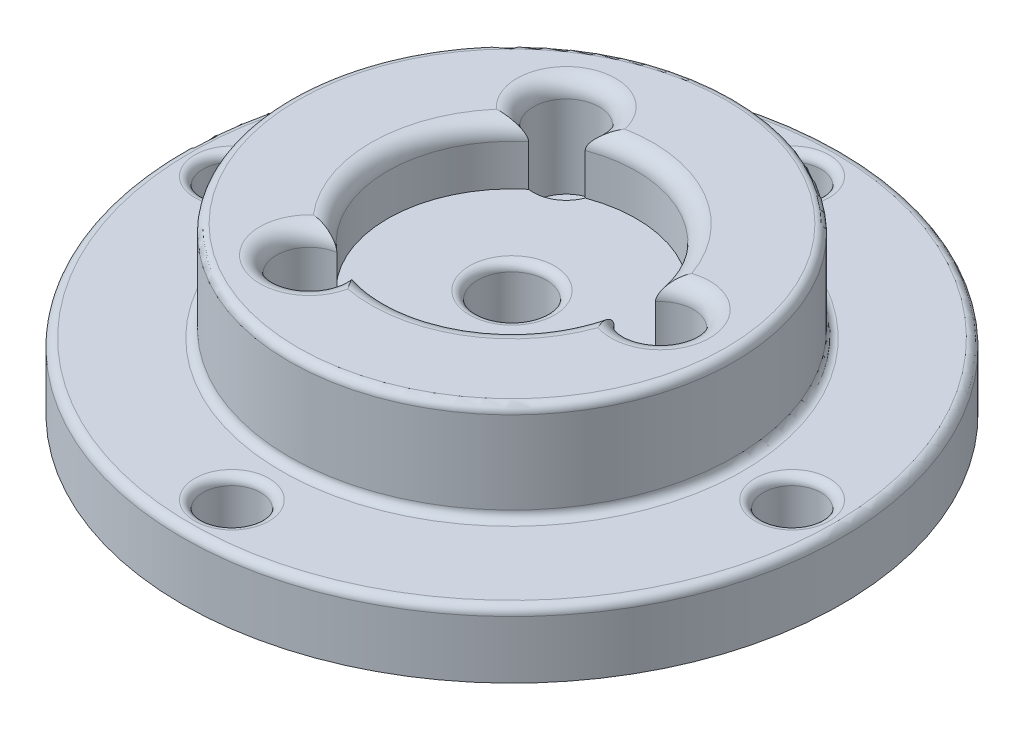
ISO-10303-21;
HEADER;
FILE_DESCRIPTION(('STEP AP214'),'2;1');
FILE_NAME('part.step','',(''),(''),'','','');
FILE_SCHEMA(('AUTOMOTIVE_DESIGN { 1 0 10303 214 1 1 1 1 }'));
ENDSEC;
DATA;
#1=APPLICATION_CONTEXT('core data for automotive mechanical design processes');
#2=APPLICATION_PROTOCOL_DEFINITION('international standard','automotive_design',2000,#1);
#3=PRODUCT_CONTEXT('',#1,'mechanical');
#4=PRODUCT('Part','Part','',(#3));
#5=PRODUCT_RELATED_PRODUCT_CATEGORY('part','',(#4));
#6=PRODUCT_DEFINITION_FORMATION('','',#4);
#7=PRODUCT_DEFINITION_CONTEXT('part definition',#1,'design');
#8=PRODUCT_DEFINITION('design','',#6,#7);
#9=PRODUCT_DEFINITION_SHAPE('','',#8);
#10=(LENGTH_UNIT() NAMED_UNIT(*) SI_UNIT(.MILLI.,.METRE.));
#11=(NAMED_UNIT(*) PLANE_ANGLE_UNIT() SI_UNIT($,.RADIAN.));
#12=(NAMED_UNIT(*) SI_UNIT($,.STERADIAN.) SOLID_ANGLE_UNIT());
#13=UNCERTAINTY_MEASURE_WITH_UNIT(LENGTH_MEASURE(1.E-05),#10,'distance_accuracy_value','');
#14=(GEOMETRIC_REPRESENTATION_CONTEXT(3) GLOBAL_UNCERTAINTY_ASSIGNED_CONTEXT((#13)) GLOBAL_UNIT_ASSIGNED_CONTEXT((#10,
#11,#12)) REPRESENTATION_CONTEXT('',''));
#15=CARTESIAN_POINT('',(0.,0.,0.));
#16=DIRECTION('',(0.,0.,1.));
#17=DIRECTION('',(1.,0.,0.));
#18=AXIS2_PLACEMENT_3D('',#15,#16,#17);
#19=CARTESIAN_POINT('',(0.,2.5,0.));
#20=DIRECTION('',(0.,1.,0.));
#21=DIRECTION('',(0.,0.,1.));
#22=AXIS2_PLACEMENT_3D('',#19,#20,#21);
#23=CYLINDRICAL_SURFACE('',#22,7.55);
#24=DIRECTION('',(0.,1.,0.));
#25=VECTOR('',#24,1.);
#26=CARTESIAN_POINT('',(7.44458333333333,3.,-1.25725056892234));
#27=LINE('',#26,#25);
#28=CARTESIAN_POINT('',(7.44458333333333,2.5,-1.25725056892234));
#29=VERTEX_POINT('',#28);
#30=CARTESIAN_POINT('',(7.44458333333333,5.,-1.25725056892234));
#31=VERTEX_POINT('',#30);
#32=EDGE_CURVE('E131',#29,#31,#27,.T.);
#33=ORIENTED_EDGE('',*,*,#32,.T.);
#34=CARTESIAN_POINT('',(0.,5.,0.));
#35=DIRECTION('',(0.,1.,0.));
#36=DIRECTION('',(0.,0.,1.));
#37=AXIS2_PLACEMENT_3D('',#34,#35,#36);
#38=CIRCLE('',#37,7.55);
#39=CARTESIAN_POINT('',(-2.63348073505741,5.,-7.0758235717181));
#40=VERTEX_POINT('',#39);
#41=EDGE_CURVE('E59',#31,#40,#38,.T.);
#42=ORIENTED_EDGE('',*,*,#41,.T.);
#43=DIRECTION('',(0.,1.,0.));
#44=VECTOR('',#43,1.);
#45=CARTESIAN_POINT('',(-2.63348073505741,3.,-7.0758235717181));
#46=LINE('',#45,#44);
#47=CARTESIAN_POINT('',(-2.63348073505741,2.5,-7.0758235717181));
#48=VERTEX_POINT('',#47);
#49=EDGE_CURVE('E106',#40,#48,#46,.F.);
#50=ORIENTED_EDGE('',*,*,#49,.T.);
#51=CARTESIAN_POINT('',(0.,2.5,0.));
#52=DIRECTION('',(0.,1.,0.));
#53=DIRECTION('',(0.,0.,1.));
#54=AXIS2_PLACEMENT_3D('',#51,#52,#53);
#55=CIRCLE('',#54,7.55);
#56=EDGE_CURVE('E109',#29,#48,#55,.T.);
#57=ORIENTED_EDGE('',*,*,#56,.F.);
#58=EDGE_LOOP('',(#33,#42,#50,#57));
#59=FACE_BOUND('',#58,.T.);
#60=ADVANCED_FACE('F36',(#59),#23,.F.);
#61=DIRECTION('',(0.,1.,0.));
#62=VECTOR('',#61,1.);
#63=CARTESIAN_POINT('',(-2.63348073505751,3.,7.07582357171806));
#64=LINE('',#63,#62);
#65=CARTESIAN_POINT('',(-2.63348073505752,2.5,7.07582357171806));
#66=VERTEX_POINT('',#65);
#67=CARTESIAN_POINT('',(-2.63348073505751,5.,7.07582357171806));
#68=VERTEX_POINT('',#67);
#69=EDGE_CURVE('E135',#66,#68,#64,.T.);
#70=ORIENTED_EDGE('',*,*,#69,.T.);
#71=CARTESIAN_POINT('',(0.,5.,0.));
#72=DIRECTION('',(0.,1.,0.));
#73=DIRECTION('',(0.,0.,1.));
#74=AXIS2_PLACEMENT_3D('',#71,#72,#73);
#75=CIRCLE('',#74,7.55);
#76=CARTESIAN_POINT('',(7.44458333333333,5.,1.25725056892234));
#77=VERTEX_POINT('',#76);
#78=EDGE_CURVE('E387',#68,#77,#75,.T.);
#79=ORIENTED_EDGE('',*,*,#78,.T.);
#80=DIRECTION('',(0.,1.,0.));
#81=VECTOR('',#80,1.);
#82=CARTESIAN_POINT('',(7.44458333333333,3.,1.25725056892234));
#83=LINE('',#82,#81);
#84=CARTESIAN_POINT('',(7.44458333333333,2.5,1.25725056892234));
#85=VERTEX_POINT('',#84);
#86=EDGE_CURVE('E134',#77,#85,#83,.F.);
#87=ORIENTED_EDGE('',*,*,#86,.T.);
#88=EDGE_CURVE('E129',#66,#85,#55,.T.);
#89=ORIENTED_EDGE('',*,*,#88,.F.);
#90=EDGE_LOOP('',(#70,#79,#87,#89));
#91=FACE_BOUND('',#90,.T.);
#92=ADVANCED_FACE('F193',(#91),#23,.F.);
#93=CARTESIAN_POINT('',(0.,6.,0.));
#94=DIRECTION('',(0.,-1.,0.));
#95=DIRECTION('',(0.,0.,-1.));
#96=AXIS2_PLACEMENT_3D('',#93,#94,#95);
#97=CYLINDRICAL_SURFACE('',#96,13.5);
#98=CARTESIAN_POINT('',(0.,5.5,0.));
#99=DIRECTION('',(0.,1.,0.));
#100=DIRECTION('',(0.,0.,1.));
#101=AXIS2_PLACEMENT_3D('',#98,#99,#100);
#102=CIRCLE('',#101,13.5);
#103=CARTESIAN_POINT('',(0.,5.5,13.5));
#104=VERTEX_POINT('',#103);
#105=EDGE_CURVE('E297',#104,#104,#102,.F.);
#106=ORIENTED_EDGE('',*,*,#105,.T.);
#107=EDGE_LOOP('',(#106));
#108=FACE_BOUND('',#107,.T.);
#109=CARTESIAN_POINT('',(0.,0.5,0.));
#110=DIRECTION('',(0.,-1.,0.));
#111=DIRECTION('',(0.,0.,-1.));
#112=AXIS2_PLACEMENT_3D('',#109,#110,#111);
#113=CIRCLE('',#112,13.5);
#114=CARTESIAN_POINT('',(0.,0.5,-13.5));
#115=VERTEX_POINT('',#114);
#116=EDGE_CURVE('E235',#115,#115,#113,.F.);
#117=ORIENTED_EDGE('',*,*,#116,.T.);
#118=EDGE_LOOP('',(#117));
#119=FACE_BOUND('',#118,.T.);
#120=ADVANCED_FACE('F199',(#108,#119),#97,.T.);
#121=CARTESIAN_POINT('',(0.,6.,0.));
#122=DIRECTION('',(0.,1.,0.));
#123=DIRECTION('',(0.,0.,1.));
#124=AXIS2_PLACEMENT_3D('',#121,#122,#123);
#125=PLANE('',#124);
#126=CARTESIAN_POINT('',(0.,6.,0.));
#127=DIRECTION('',(0.,1.,0.));
#128=DIRECTION('',(0.,0.,1.));
#129=AXIS2_PLACEMENT_3D('',#126,#127,#128);
#130=CIRCLE('',#129,13.);
#131=CARTESIAN_POINT('',(0.,6.,13.));
#132=VERTEX_POINT('',#131);
#133=EDGE_CURVE('E232',#132,#132,#130,.T.);
#134=ORIENTED_EDGE('',*,*,#133,.T.);
#135=EDGE_LOOP('',(#134));
#136=FACE_BOUND('',#135,.T.);
#137=CARTESIAN_POINT('',(0.,6.,0.));
#138=DIRECTION('',(0.,1.,0.));
#139=DIRECTION('',(0.,0.,1.));
#140=AXIS2_PLACEMENT_3D('',#137,#138,#139);
#141=CIRCLE('',#140,8.55);
#142=CARTESIAN_POINT('',(8.06125,6.,2.84934175512521));
#143=VERTEX_POINT('',#142);
#144=CARTESIAN_POINT('',(-1.56302265599787,6.,8.4059181638199));
#145=VERTEX_POINT('',#144);
#146=EDGE_CURVE('E376',#143,#145,#141,.F.);
#147=ORIENTED_EDGE('',*,*,#146,.T.);
#148=CARTESIAN_POINT('',(-4.50000000000004,6.,7.79422863405993));
#149=DIRECTION('',(0.,1.,0.));
#150=DIRECTION('',(0.,0.,1.));
#151=AXIS2_PLACEMENT_3D('',#148,#149,#150);
#152=CIRCLE('',#151,3.);
#153=CARTESIAN_POINT('',(-6.49822734400219,6.,5.55657640869467));
#154=VERTEX_POINT('',#153);
#155=EDGE_CURVE('E378',#145,#154,#152,.F.);
#156=ORIENTED_EDGE('',*,*,#155,.T.);
#157=CARTESIAN_POINT('',(0.,6.,0.));
#158=DIRECTION('',(0.,1.,0.));
#159=DIRECTION('',(0.,0.,1.));
#160=AXIS2_PLACEMENT_3D('',#157,#158,#159);
#161=CIRCLE('',#160,8.55);
#162=CARTESIAN_POINT('',(-6.49822734400212,6.,-5.55657640869476));
#163=VERTEX_POINT('',#162);
#164=EDGE_CURVE('E397',#154,#163,#161,.F.);
#165=ORIENTED_EDGE('',*,*,#164,.T.);
#166=CARTESIAN_POINT('',(-4.49999999999993,6.,-7.79422863405999));
#167=DIRECTION('',(0.,1.,0.));
#168=DIRECTION('',(0.,0.,1.));
#169=AXIS2_PLACEMENT_3D('',#166,#167,#168);
#170=CIRCLE('',#169,3.);
#171=CARTESIAN_POINT('',(-1.56302265599775,6.,-8.40591816381992));
#172=VERTEX_POINT('',#171);
#173=EDGE_CURVE('E222',#163,#172,#170,.F.);
#174=ORIENTED_EDGE('',*,*,#173,.T.);
#175=CARTESIAN_POINT('',(0.,6.,0.));
#176=DIRECTION('',(0.,1.,0.));
#177=DIRECTION('',(0.,0.,1.));
#178=AXIS2_PLACEMENT_3D('',#175,#176,#177);
#179=CIRCLE('',#178,8.55);
#180=CARTESIAN_POINT('',(8.06125,6.,-2.84934175512521));
#181=VERTEX_POINT('',#180);
#182=EDGE_CURVE('E407',#172,#181,#179,.F.);
#183=ORIENTED_EDGE('',*,*,#182,.T.);
#184=CARTESIAN_POINT('',(9.,6.,0.));
#185=DIRECTION('',(0.,1.,0.));
#186=DIRECTION('',(0.,0.,1.));
#187=AXIS2_PLACEMENT_3D('',#184,#185,#186);
#188=CIRCLE('',#187,3.);
#189=EDGE_CURVE('E380',#181,#143,#188,.F.);
#190=ORIENTED_EDGE('',*,*,#189,.T.);
#191=EDGE_LOOP('',(#147,#156,#165,#174,#183,#190));
#192=FACE_BOUND('',#191,.T.);
#193=ADVANCED_FACE('F204',(#136,#192),#125,.T.);
#194=DIRECTION('',(0.,1.,0.));
#195=VECTOR('',#194,1.);
#196=CARTESIAN_POINT('',(-4.8111025982758,3.,-5.81857300279578));
#197=LINE('',#196,#195);
#198=CARTESIAN_POINT('',(-4.8111025982758,2.5,-5.81857300279577));
#199=VERTEX_POINT('',#198);
#200=CARTESIAN_POINT('',(-4.8111025982758,5.,-5.81857300279578));
#201=VERTEX_POINT('',#200);
#202=EDGE_CURVE('E111',#199,#201,#197,.T.);
#203=ORIENTED_EDGE('',*,*,#202,.T.);
#204=CARTESIAN_POINT('',(0.,5.,0.));
#205=DIRECTION('',(0.,1.,0.));
#206=DIRECTION('',(0.,0.,1.));
#207=AXIS2_PLACEMENT_3D('',#204,#205,#206);
#208=CIRCLE('',#207,7.55);
#209=CARTESIAN_POINT('',(-4.81110259827588,5.,5.81857300279571));
#210=VERTEX_POINT('',#209);
#211=EDGE_CURVE('E214',#201,#210,#208,.T.);
#212=ORIENTED_EDGE('',*,*,#211,.T.);
#213=DIRECTION('',(0.,1.,0.));
#214=VECTOR('',#213,1.);
#215=CARTESIAN_POINT('',(-4.81110259827588,3.,5.81857300279571));
#216=LINE('',#215,#214);
#217=CARTESIAN_POINT('',(-4.81110259827588,2.5,5.81857300279571));
#218=VERTEX_POINT('',#217);
#219=EDGE_CURVE('E140',#210,#218,#216,.F.);
#220=ORIENTED_EDGE('',*,*,#219,.T.);
#221=EDGE_CURVE('E127',#199,#218,#55,.T.);
#222=ORIENTED_EDGE('',*,*,#221,.F.);
#223=EDGE_LOOP('',(#203,#212,#220,#222));
#224=FACE_BOUND('',#223,.T.);
#225=ADVANCED_FACE('F195',(#224),#23,.F.);
#226=CARTESIAN_POINT('',(0.,2.5,0.));
#227=DIRECTION('',(0.,1.,0.));
#228=DIRECTION('',(0.,0.,1.));
#229=AXIS2_PLACEMENT_3D('',#226,#227,#228);
#230=PLANE('',#229);
#231=CARTESIAN_POINT('',(0.,2.5,0.));
#232=DIRECTION('',(0.,1.,0.));
#233=DIRECTION('',(0.,0.,1.));
#234=AXIS2_PLACEMENT_3D('',#231,#232,#233);
#235=CIRCLE('',#234,2.58280416560833);
#236=CARTESIAN_POINT('',(0.,2.5,2.58280416560833));
#237=VERTEX_POINT('',#236);
#238=EDGE_CURVE('E312',#237,#237,#235,.F.);
#239=ORIENTED_EDGE('',*,*,#238,.T.);
#240=EDGE_LOOP('',(#239));
#241=FACE_BOUND('',#240,.T.);
#242=CARTESIAN_POINT('',(9.,2.5,0.));
#243=DIRECTION('',(0.,1.,0.));
#244=DIRECTION('',(0.,0.,1.));
#245=AXIS2_PLACEMENT_3D('',#242,#243,#244);
#246=CIRCLE('',#245,2.);
#247=EDGE_CURVE('E126',#29,#85,#246,.T.);
#248=ORIENTED_EDGE('',*,*,#247,.F.);
#249=ORIENTED_EDGE('',*,*,#56,.T.);
#250=CARTESIAN_POINT('',(-4.49999999999993,2.5,-7.79422863405999));
#251=DIRECTION('',(0.,1.,0.));
#252=DIRECTION('',(0.,0.,1.));
#253=AXIS2_PLACEMENT_3D('',#250,#251,#252);
#254=CIRCLE('',#253,2.);
#255=EDGE_CURVE('E115',#199,#48,#254,.T.);
#256=ORIENTED_EDGE('',*,*,#255,.F.);
#257=ORIENTED_EDGE('',*,*,#221,.T.);
#258=CARTESIAN_POINT('',(-4.50000000000004,2.5,7.79422863405993));
#259=DIRECTION('',(0.,1.,0.));
#260=DIRECTION('',(0.,0.,1.));
#261=AXIS2_PLACEMENT_3D('',#258,#259,#260);
#262=CIRCLE('',#261,2.);
#263=EDGE_CURVE('E120',#66,#218,#262,.T.);
#264=ORIENTED_EDGE('',*,*,#263,.F.);
#265=ORIENTED_EDGE('',*,*,#88,.T.);
#266=EDGE_LOOP('',(#248,#249,#256,#257,#264,#265));
#267=FACE_BOUND('',#266,.T.);
#268=ADVANCED_FACE('F123',(#241,#267),#230,.T.);
#269=CARTESIAN_POINT('',(-4.49999999999993,-5.65685424949238,-7.79422863405999));
#270=DIRECTION('',(0.,1.,0.));
#271=DIRECTION('',(0.,0.,1.));
#272=AXIS2_PLACEMENT_3D('',#269,#270,#271);
#273=CYLINDRICAL_SURFACE('',#272,2.);
#274=CARTESIAN_POINT('',(-4.49999999999993,0.,-7.79422863405999));
#275=DIRECTION('',(0.,1.,0.));
#276=DIRECTION('',(0.,0.,1.));
#277=AXIS2_PLACEMENT_3D('',#274,#275,#276);
#278=CIRCLE('',#277,2.);
#279=CARTESIAN_POINT('',(-4.49999999999993,0.,-5.79422863405999));
#280=VERTEX_POINT('',#279);
#281=EDGE_CURVE('E143',#280,#280,#278,.F.);
#282=ORIENTED_EDGE('',*,*,#281,.T.);
#283=EDGE_LOOP('',(#282));
#284=FACE_BOUND('',#283,.T.);
#285=ORIENTED_EDGE('',*,*,#49,.F.);
#286=CARTESIAN_POINT('',(-4.49999999999993,5.,-7.79422863405999));
#287=DIRECTION('',(0.,1.,0.));
#288=DIRECTION('',(0.,0.,1.));
#289=AXIS2_PLACEMENT_3D('',#286,#287,#288);
#290=CIRCLE('',#289,2.);
#291=EDGE_CURVE('E51',#40,#201,#290,.T.);
#292=ORIENTED_EDGE('',*,*,#291,.T.);
#293=ORIENTED_EDGE('',*,*,#202,.F.);
#294=ORIENTED_EDGE('',*,*,#255,.T.);
#295=EDGE_LOOP('',(#285,#292,#293,#294));
#296=FACE_BOUND('',#295,.T.);
#297=ADVANCED_FACE('F116',(#284,#296),#273,.F.);
#298=CARTESIAN_POINT('',(-4.50000000000004,-5.65685424949238,7.79422863405993));
#299=DIRECTION('',(0.,1.,0.));
#300=DIRECTION('',(0.,0.,1.));
#301=AXIS2_PLACEMENT_3D('',#298,#299,#300);
#302=CYLINDRICAL_SURFACE('',#301,2.);
#303=CARTESIAN_POINT('',(-4.50000000000004,0.,7.79422863405993));
#304=DIRECTION('',(0.,1.,0.));
#305=DIRECTION('',(0.,0.,1.));
#306=AXIS2_PLACEMENT_3D('',#303,#304,#305);
#307=CIRCLE('',#306,2.);
#308=CARTESIAN_POINT('',(-4.50000000000004,0.,9.79422863405993));
#309=VERTEX_POINT('',#308);
#310=EDGE_CURVE('E146',#309,#309,#307,.F.);
#311=ORIENTED_EDGE('',*,*,#310,.T.);
#312=EDGE_LOOP('',(#311));
#313=FACE_BOUND('',#312,.T.);
#314=ORIENTED_EDGE('',*,*,#219,.F.);
#315=CARTESIAN_POINT('',(-4.50000000000004,5.,7.79422863405993));
#316=DIRECTION('',(0.,1.,0.));
#317=DIRECTION('',(0.,0.,1.));
#318=AXIS2_PLACEMENT_3D('',#315,#316,#317);
#319=CIRCLE('',#318,2.);
#320=EDGE_CURVE('E394',#210,#68,#319,.T.);
#321=ORIENTED_EDGE('',*,*,#320,.T.);
#322=ORIENTED_EDGE('',*,*,#69,.F.);
#323=ORIENTED_EDGE('',*,*,#263,.T.);
#324=EDGE_LOOP('',(#314,#321,#322,#323));
#325=FACE_BOUND('',#324,.T.);
#326=ADVANCED_FACE('F395',(#313,#325),#302,.F.);
#327=CARTESIAN_POINT('',(9.,-5.65685424949238,0.));
#328=DIRECTION('',(0.,1.,0.));
#329=DIRECTION('',(0.,0.,1.));
#330=AXIS2_PLACEMENT_3D('',#327,#328,#329);
#331=CYLINDRICAL_SURFACE('',#330,2.);
#332=CARTESIAN_POINT('',(9.,0.,0.));
#333=DIRECTION('',(0.,1.,0.));
#334=DIRECTION('',(0.,0.,1.));
#335=AXIS2_PLACEMENT_3D('',#332,#333,#334);
#336=CIRCLE('',#335,2.);
#337=CARTESIAN_POINT('',(9.,0.,2.));
#338=VERTEX_POINT('',#337);
#339=EDGE_CURVE('E150',#338,#338,#336,.F.);
#340=ORIENTED_EDGE('',*,*,#339,.T.);
#341=EDGE_LOOP('',(#340));
#342=FACE_BOUND('',#341,.T.);
#343=ORIENTED_EDGE('',*,*,#86,.F.);
#344=CARTESIAN_POINT('',(9.,5.,0.));
#345=DIRECTION('',(0.,1.,0.));
#346=DIRECTION('',(0.,0.,1.));
#347=AXIS2_PLACEMENT_3D('',#344,#345,#346);
#348=CIRCLE('',#347,2.);
#349=EDGE_CURVE('E391',#77,#31,#348,.T.);
#350=ORIENTED_EDGE('',*,*,#349,.T.);
#351=ORIENTED_EDGE('',*,*,#32,.F.);
#352=ORIENTED_EDGE('',*,*,#247,.T.);
#353=EDGE_LOOP('',(#343,#350,#351,#352));
#354=FACE_BOUND('',#353,.T.);
#355=ADVANCED_FACE('F401',(#342,#354),#331,.F.);
#356=CARTESIAN_POINT('',(0.,5.,0.));
#357=DIRECTION('',(0.,1.,0.));
#358=DIRECTION('',(0.,0.,1.));
#359=AXIS2_PLACEMENT_3D('',#356,#357,#358);
#360=TOROIDAL_SURFACE('',#359,8.55,1.);
#361=CARTESIAN_POINT('',(7.44458333333333,5.,-1.25725056892234));
#362=CARTESIAN_POINT('',(7.4445647885597,5.0267225320528,-1.25716090793745));
#363=CARTESIAN_POINT('',(7.44524274247197,5.05330728902451,-1.25976901804322));
#364=CARTESIAN_POINT('',(7.44780199959746,5.10517367760473,-1.26949537867082));
#365=CARTESIAN_POINT('',(7.44966456957664,5.13046908864193,-1.27654340123668));
#366=CARTESIAN_POINT('',(7.45519279582035,5.18765308980465,-1.29722777657181));
#367=CARTESIAN_POINT('',(7.45924960034199,5.21898081674017,-1.31226724835701));
#368=CARTESIAN_POINT('',(7.46876226362171,5.27901608402712,-1.34682934080304));
#369=CARTESIAN_POINT('',(7.47422820022705,5.30770264149835,-1.36638414455061));
#370=CARTESIAN_POINT('',(7.48577396411727,5.36034235362374,-1.40680124417085));
#371=CARTESIAN_POINT('',(7.49177124891231,5.38449040501531,-1.4274384083582));
#372=CARTESIAN_POINT('',(7.50454939430536,5.43089856346612,-1.47052805503619));
#373=CARTESIAN_POINT('',(7.51133093133084,5.45315701159365,-1.49298209952081));
#374=CARTESIAN_POINT('',(7.53271389688002,5.51748207951449,-1.56235375794717));
#375=CARTESIAN_POINT('',(7.54834648177015,5.5570674654802,-1.61125527576173));
#376=CARTESIAN_POINT('',(7.58090374678513,5.62856894469214,-1.70913214123616));
#377=CARTESIAN_POINT('',(7.59769448870377,5.66080281257661,-1.75792676004539));
#378=CARTESIAN_POINT('',(7.63314919242165,5.72096737363547,-1.85750328960458));
#379=CARTESIAN_POINT('',(7.6518146268879,5.74889463939806,-1.90828674327833));
#380=CARTESIAN_POINT('',(7.69088113647134,5.80059554941123,-2.0113108663104));
#381=CARTESIAN_POINT('',(7.71128313708519,5.82436695794202,-2.06355230260086));
#382=CARTESIAN_POINT('',(7.75369428019599,5.86770422508138,-2.1691207984403));
#383=CARTESIAN_POINT('',(7.7757037560438,5.88726920804419,-2.22244808150416));
#384=CARTESIAN_POINT('',(7.83798073719717,5.93484731343735,-2.36951474031499));
#385=CARTESIAN_POINT('',(7.87975263011734,5.95846405779527,-2.46408040815507));
#386=CARTESIAN_POINT('',(7.96681417072952,5.99083848270185,-2.65387176179508));
#387=CARTESIAN_POINT('',(8.01209042258863,5.99965008236267,-2.74909377884721));
#388=CARTESIAN_POINT('',(8.05939205847958,5.99999659306099,-2.8455563143397));
#389=CARTESIAN_POINT('',(8.0603208123445,5.99999999852331,-2.84744917011334));
#390=CARTESIAN_POINT('',(8.06125,6.,-2.84934175512521));
#391=B_SPLINE_CURVE_WITH_KNOTS('',3,(#361,#362,#363,#364,#365,#366,#367,#368,#369,#370,#371,
#372,#373,#374,#375,#376,#377,#378,#379,#380,#381,#382,#383,#384,#385,#386,#387,#388,#389,#390),
.UNSPECIFIED.,.F.,.F.,(4,2,2,2,2,2,2,2,2,2,2,2,2,2,4),(0.,0.0798116736925976,0.158391583124934,
0.262761758684378,0.367900142650982,0.464737418574431,0.561658849723867,0.755623007372659,
0.937941040380744,1.12040343067751,1.30296367992436,1.4855618957669,1.80269526964844,
2.11867114637516,2.12499644060904),.UNSPECIFIED.);
#392=EDGE_CURVE('E225',#181,#31,#391,.F.);
#393=ORIENTED_EDGE('',*,*,#392,.F.);
#394=ORIENTED_EDGE('',*,*,#182,.F.);
#395=CARTESIAN_POINT('',(-2.63348073505741,5.,-7.0758235717181));
#396=CARTESIAN_POINT('',(-2.63354911136124,5.0267225320528,-7.07576268098058));
#397=CARTESIAN_POINT('',(-2.63162939870992,5.05330728902451,-7.07765386134408));
#398=CARTESIAN_POINT('',(-2.62448575188279,5.10517367760473,-7.08473342334338));
#399=CARTESIAN_POINT('',(-2.61931327028389,5.13046908864193,-7.0898704675446));
#400=CARTESIAN_POINT('',(-2.60416418890412,5.18765308980465,-7.10500023957709));
#401=CARTESIAN_POINT('',(-2.59316802653945,5.21898081674017,-7.11603327124361));
#402=CARTESIAN_POINT('',(-2.56799270811311,5.27901608402712,-7.14155252552451));
#403=CARTESIAN_POINT('',(-2.55379071960436,5.30770264149835,-7.15606356735399));
#404=CARTESIAN_POINT('',(-2.52456136653106,5.36034235362374,-7.18627104199914));
#405=CARTESIAN_POINT('',(-2.50968770048026,5.38449040501531,-7.20178342507906));
#406=CARTESIAN_POINT('',(-2.47876004451355,5.43089856346612,-7.23439444694168));
#407=CARTESIAN_POINT('',(-2.4627050400849,5.45315701159365,-7.25149445252476));
#408=CARTESIAN_POINT('',(-2.41331890435961,5.51748207951449,-7.30469847311178));
#409=CARTESIAN_POINT('',(-2.37878524009364,5.5570674654802,-7.34268744766073));
#410=CARTESIAN_POINT('',(-2.31030002065749,5.62856894469213,-7.41982129897865));
#411=CARTESIAN_POINT('',(-2.27643801216004,5.6608028125766,-7.4587598174332));
#412=CARTESIAN_POINT('',(-2.20792955980003,5.72096737363547,-7.53925275631612));
#413=CARTESIAN_POINT('',(-2.17328251605977,5.74889463939806,-7.58080922357345));
#414=CARTESIAN_POINT('',(-2.10359426310311,5.80059554941123,-7.66615387482593));
#415=CARTESIAN_POINT('',(-2.06855285245232,5.82436695794202,-7.70994324379078));
#416=CARTESIAN_POINT('',(-1.99833342477143,5.86770422508138,-7.79945661904799));
#417=CARTESIAN_POINT('',(-1.96315538084722,5.88726920804419,-7.84518102578809));
#418=CARTESIAN_POINT('',(-1.86693040884407,5.93484731343735,-7.97264780294336));
#419=CARTESIAN_POINT('',(-1.80592008462892,5.95846405779528,-8.05610615729652));
#420=CARTESIAN_POINT('',(-1.68508672126383,5.99083848270185,-8.22639933997909));
#421=CARTESIAN_POINT('',(-1.62526016142623,5.99965008236267,-8.31322073280301));
#422=CARTESIAN_POINT('',(-1.56537197312229,5.99999659306099,-8.40241641887173));
#423=CARTESIAN_POINT('',(-1.56419708886909,5.99999999852331,-8.40416717119944));
#424=CARTESIAN_POINT('',(-1.56302265599775,6.,-8.40591816381992));
#425=B_SPLINE_CURVE_WITH_KNOTS('',3,(#395,#396,#397,#398,#399,#400,#401,#402,#403,#404,#405,
#406,#407,#408,#409,#410,#411,#412,#413,#414,#415,#416,#417,#418,#419,#420,#421,#422,#423,#424),
.UNSPECIFIED.,.F.,.F.,(4,2,2,2,2,2,2,2,2,2,2,2,2,2,4),(0.,0.0798116736925983,0.158391583124934,
0.262761758684379,0.36790014265098,0.464737418574431,0.561658849723868,0.755623007372658,
0.937941040380736,1.12040343067749,1.30296367992436,1.4855618957669,1.80269526964845,
2.11867114637516,2.12499644060904),.UNSPECIFIED.);
#426=EDGE_CURVE('E112',#40,#172,#425,.T.);
#427=ORIENTED_EDGE('',*,*,#426,.F.);
#428=ORIENTED_EDGE('',*,*,#41,.F.);
#429=EDGE_LOOP('',(#393,#394,#427,#428));
#430=FACE_BOUND('',#429,.T.);
#431=ADVANCED_FACE('F286',(#430),#360,.T.);
#432=CARTESIAN_POINT('',(-4.49999999999993,5.,-7.79422863405999));
#433=DIRECTION('',(0.,1.,0.));
#434=DIRECTION('',(0.,0.,1.));
#435=AXIS2_PLACEMENT_3D('',#432,#433,#434);
#436=TOROIDAL_SURFACE('',#435,3.,1.);
#437=ORIENTED_EDGE('',*,*,#426,.T.);
#438=ORIENTED_EDGE('',*,*,#173,.F.);
#439=CARTESIAN_POINT('',(-4.8111025982758,5.,-5.81857300279577));
#440=CARTESIAN_POINT('',(-4.81101567719835,5.0267225320528,-5.81860177304315));
#441=CARTESIAN_POINT('',(-4.81361334376194,5.05330728902451,-5.81788484330089));
#442=CARTESIAN_POINT('',(-4.82331624771455,5.10517367760473,-5.81523804467258));
#443=CARTESIAN_POINT('',(-4.83035129929262,5.13046908864193,-5.81332706630794));
#444=CARTESIAN_POINT('',(-4.85102860691611,5.18765308980465,-5.8077724630053));
#445=CARTESIAN_POINT('',(-4.86608157380241,5.21898081674017,-5.80376602288662));
#446=CARTESIAN_POINT('',(-4.90076955550848,5.27901608402712,-5.7947231847215));
#447=CARTESIAN_POINT('',(-4.92043748062256,5.30770264149835,-5.78967942280341));
#448=CARTESIAN_POINT('',(-4.96121259758609,5.36034235362374,-5.77946979782832));
#449=CARTESIAN_POINT('',(-4.98208354843193,5.38449040501531,-5.77434501672088));
#450=CARTESIAN_POINT('',(-5.02578934979169,5.43089856346612,-5.76386639190552));
#451=CARTESIAN_POINT('',(-5.04862589124582,5.45315701159365,-5.75851235300397));
#452=CARTESIAN_POINT('',(-5.11939499252029,5.51748207951449,-5.74234471516463));
#453=CARTESIAN_POINT('',(-5.16956124167638,5.55706746548021,-5.73143217189902));
#454=CARTESIAN_POINT('',(-5.27060372612752,5.62856894469213,-5.71068915774252));
#455=CARTESIAN_POINT('',(-5.3212564765436,5.6608028125766,-5.70083305738784));
#456=CARTESIAN_POINT('',(-5.42521963262149,5.72096737363547,-5.68174946671158));
#457=CARTESIAN_POINT('',(-5.478532110828,5.74889463939806,-5.67252248029515));
#458=CARTESIAN_POINT('',(-5.5872868733681,5.80059554941123,-5.65484300851557));
#459=CARTESIAN_POINT('',(-5.64273028463275,5.82436695794202,-5.64639094118997));
#460=CARTESIAN_POINT('',(-5.75536085542443,5.86770422508138,-5.63033582060773));
#461=CARTESIAN_POINT('',(-5.81254837519643,5.88726920804419,-5.62273294428396));
#462=CARTESIAN_POINT('',(-5.97105032835301,5.93484731343735,-5.60313306262843));
#463=CARTESIAN_POINT('',(-6.07383254548846,5.95846405779528,-5.59202574914156));
#464=CARTESIAN_POINT('',(-6.28172744946541,5.99083848270185,-5.57252757818396));
#465=CARTESIAN_POINT('',(-6.38683026116167,5.99965008236267,-5.56412695395551));
#466=CARTESIAN_POINT('',(-6.49402008535714,5.99999659306099,-5.55686010453206));
#467=CARTESIAN_POINT('',(-6.49612372347527,5.99999999852331,-5.55671800108613));
#468=CARTESIAN_POINT('',(-6.49822734400212,6.,-5.55657640869476));
#469=B_SPLINE_CURVE_WITH_KNOTS('',3,(#439,#440,#441,#442,#443,#444,#445,#446,#447,#448,#449,
#450,#451,#452,#453,#454,#455,#456,#457,#458,#459,#460,#461,#462,#463,#464,#465,#466,#467,#468),
.UNSPECIFIED.,.F.,.F.,(4,2,2,2,2,2,2,2,2,2,2,2,2,2,4),(0.,0.0798116736925975,0.158391583124934,
0.262761758684379,0.367900142650981,0.464737418574431,0.561658849723868,0.755623007372659,
0.937941040380736,1.12040343067749,1.30296367992436,1.4855618957669,1.80269526964846,
2.11867114637515,2.12499644060904),.UNSPECIFIED.);
#470=EDGE_CURVE('E219',#201,#163,#469,.T.);
#471=ORIENTED_EDGE('',*,*,#470,.F.);
#472=ORIENTED_EDGE('',*,*,#291,.F.);
#473=EDGE_LOOP('',(#437,#438,#471,#472));
#474=FACE_BOUND('',#473,.T.);
#475=ADVANCED_FACE('F221',(#474),#436,.T.);
#476=CARTESIAN_POINT('',(9.,5.,0.));
#477=DIRECTION('',(0.,1.,0.));
#478=DIRECTION('',(0.,0.,1.));
#479=AXIS2_PLACEMENT_3D('',#476,#477,#478);
#480=TOROIDAL_SURFACE('',#479,3.,1.);
#481=ORIENTED_EDGE('',*,*,#392,.T.);
#482=ORIENTED_EDGE('',*,*,#349,.F.);
#483=CARTESIAN_POINT('',(7.44458333333333,5.,1.25725056892234));
#484=CARTESIAN_POINT('',(7.4445647885597,5.0267225320528,1.25716090793745));
#485=CARTESIAN_POINT('',(7.44524274247197,5.05330728902451,1.25976901804322));
#486=CARTESIAN_POINT('',(7.44780199959746,5.10517367760473,1.26949537867082));
#487=CARTESIAN_POINT('',(7.44966456957664,5.13046908864193,1.27654340123668));
#488=CARTESIAN_POINT('',(7.45519279582035,5.18765308980465,1.29722777657181));
#489=CARTESIAN_POINT('',(7.45924960034199,5.21898081674017,1.31226724835701));
#490=CARTESIAN_POINT('',(7.46876226362171,5.27901608402712,1.34682934080304));
#491=CARTESIAN_POINT('',(7.47422820022705,5.30770264149835,1.36638414455061));
#492=CARTESIAN_POINT('',(7.48577396411727,5.36034235362374,1.40680124417085));
#493=CARTESIAN_POINT('',(7.49177124891231,5.38449040501531,1.4274384083582));
#494=CARTESIAN_POINT('',(7.50454939430536,5.43089856346612,1.47052805503619));
#495=CARTESIAN_POINT('',(7.51133093133084,5.45315701159365,1.49298209952081));
#496=CARTESIAN_POINT('',(7.53271389688002,5.51748207951449,1.56235375794717));
#497=CARTESIAN_POINT('',(7.54834648177015,5.5570674654802,1.61125527576173));
#498=CARTESIAN_POINT('',(7.58090374678513,5.62856894469214,1.70913214123616));
#499=CARTESIAN_POINT('',(7.59769448870377,5.66080281257661,1.75792676004539));
#500=CARTESIAN_POINT('',(7.63314919242165,5.72096737363547,1.85750328960458));
#501=CARTESIAN_POINT('',(7.6518146268879,5.74889463939806,1.90828674327833));
#502=CARTESIAN_POINT('',(7.69088113647134,5.80059554941123,2.0113108663104));
#503=CARTESIAN_POINT('',(7.71128313708519,5.82436695794202,2.06355230260086));
#504=CARTESIAN_POINT('',(7.75369428019599,5.86770422508138,2.1691207984403));
#505=CARTESIAN_POINT('',(7.7757037560438,5.88726920804419,2.22244808150416));
#506=CARTESIAN_POINT('',(7.83798073719717,5.93484731343735,2.36951474031499));
#507=CARTESIAN_POINT('',(7.87975263011734,5.95846405779527,2.46408040815507));
#508=CARTESIAN_POINT('',(7.96681417072952,5.99083848270185,2.65387176179508));
#509=CARTESIAN_POINT('',(8.01209042258863,5.99965008236267,2.74909377884721));
#510=CARTESIAN_POINT('',(8.05939205847958,5.99999659306099,2.8455563143397));
#511=CARTESIAN_POINT('',(8.0603208123445,5.99999999852331,2.84744917011334));
#512=CARTESIAN_POINT('',(8.06125,6.,2.84934175512521));
#513=B_SPLINE_CURVE_WITH_KNOTS('',3,(#483,#484,#485,#486,#487,#488,#489,#490,#491,#492,#493,
#494,#495,#496,#497,#498,#499,#500,#501,#502,#503,#504,#505,#506,#507,#508,#509,#510,#511,#512),
.UNSPECIFIED.,.F.,.F.,(4,2,2,2,2,2,2,2,2,2,2,2,2,2,4),(0.,0.0798116736925976,0.158391583124934,
0.262761758684378,0.367900142650982,0.464737418574431,0.561658849723867,0.755623007372659,
0.937941040380744,1.12040343067751,1.30296367992436,1.4855618957669,1.80269526964844,
2.11867114637516,2.12499644060904),.UNSPECIFIED.);
#514=EDGE_CURVE('E226',#143,#77,#513,.F.);
#515=ORIENTED_EDGE('',*,*,#514,.F.);
#516=ORIENTED_EDGE('',*,*,#189,.F.);
#517=EDGE_LOOP('',(#481,#482,#515,#516));
#518=FACE_BOUND('',#517,.T.);
#519=ADVANCED_FACE('F265',(#518),#480,.T.);
#520=CARTESIAN_POINT('',(0.,5.,0.));
#521=DIRECTION('',(0.,1.,0.));
#522=DIRECTION('',(0.,0.,1.));
#523=AXIS2_PLACEMENT_3D('',#520,#521,#522);
#524=TOROIDAL_SURFACE('',#523,8.55,1.);
#525=ORIENTED_EDGE('',*,*,#470,.T.);
#526=ORIENTED_EDGE('',*,*,#164,.F.);
#527=CARTESIAN_POINT('',(-4.81110259827588,5.,5.81857300279571));
#528=CARTESIAN_POINT('',(-4.81101567719842,5.0267225320528,5.81860177304308));
#529=CARTESIAN_POINT('',(-4.81361334376201,5.0533072890245,5.81788484330082));
#530=CARTESIAN_POINT('',(-4.82331624771463,5.10517367760473,5.81523804467251));
#531=CARTESIAN_POINT('',(-4.8303512992927,5.13046908864193,5.81332706630787));
#532=CARTESIAN_POINT('',(-4.85102860691619,5.18765308980465,5.80777246300523));
#533=CARTESIAN_POINT('',(-4.86608157380249,5.21898081674017,5.80376602288656));
#534=CARTESIAN_POINT('',(-4.90076955550856,5.27901608402712,5.79472318472143));
#535=CARTESIAN_POINT('',(-4.92043748062264,5.30770264149835,5.78967942280334));
#536=CARTESIAN_POINT('',(-4.96121259758617,5.36034235362373,5.77946979782825));
#537=CARTESIAN_POINT('',(-4.982083548432,5.38449040501531,5.77434501672081));
#538=CARTESIAN_POINT('',(-5.02578934979177,5.43089856346612,5.76386639190545));
#539=CARTESIAN_POINT('',(-5.04862589124589,5.45315701159365,5.75851235300391));
#540=CARTESIAN_POINT('',(-5.11939499252036,5.51748207951449,5.74234471516456));
#541=CARTESIAN_POINT('',(-5.16956124167646,5.5570674654802,5.73143217189895));
#542=CARTESIAN_POINT('',(-5.27060372612759,5.62856894469213,5.71068915774245));
#543=CARTESIAN_POINT('',(-5.32125647654368,5.6608028125766,5.70083305738777));
#544=CARTESIAN_POINT('',(-5.42521963262156,5.72096737363547,5.68174946671151));
#545=CARTESIAN_POINT('',(-5.47853211082807,5.74889463939806,5.67252248029508));
#546=CARTESIAN_POINT('',(-5.58728687336818,5.80059554941123,5.6548430085155));
#547=CARTESIAN_POINT('',(-5.64273028463283,5.82436695794201,5.64639094118989));
#548=CARTESIAN_POINT('',(-5.7553608554245,5.86770422508138,5.63033582060765));
#549=CARTESIAN_POINT('',(-5.81254837519651,5.88726920804419,5.62273294428388));
#550=CARTESIAN_POINT('',(-5.97105032835308,5.93484731343735,5.60313306262834));
#551=CARTESIAN_POINT('',(-6.07383254548853,5.95846405779528,5.59202574914147));
#552=CARTESIAN_POINT('',(-6.28172744946549,5.99083848270185,5.57252757818388));
#553=CARTESIAN_POINT('',(-6.38683026116175,5.99965008236267,5.56412695395546));
#554=CARTESIAN_POINT('',(-6.49402008535721,5.99999659306099,5.55686010453197));
#555=CARTESIAN_POINT('',(-6.49612372347535,5.99999999852331,5.55671800108605));
#556=CARTESIAN_POINT('',(-6.4982273440022,6.,5.55657640869467));
#557=B_SPLINE_CURVE_WITH_KNOTS('',3,(#527,#528,#529,#530,#531,#532,#533,#534,#535,#536,#537,
#538,#539,#540,#541,#542,#543,#544,#545,#546,#547,#548,#549,#550,#551,#552,#553,#554,#555,#556),
.UNSPECIFIED.,.F.,.F.,(4,2,2,2,2,2,2,2,2,2,2,2,2,2,4),(0.,0.079811673692597,0.158391583124933,
0.262761758684377,0.367900142650979,0.46473741857443,0.561658849723869,0.755623007372657,
0.937941040380735,1.12040343067749,1.30296367992436,1.4855618957669,1.80269526964846,
2.11867114637516,2.12499644060904),.UNSPECIFIED.);
#558=EDGE_CURVE('E230',#210,#154,#557,.T.);
#559=ORIENTED_EDGE('',*,*,#558,.F.);
#560=ORIENTED_EDGE('',*,*,#211,.F.);
#561=EDGE_LOOP('',(#525,#526,#559,#560));
#562=FACE_BOUND('',#561,.T.);
#563=ADVANCED_FACE('F229',(#562),#524,.T.);
#564=CARTESIAN_POINT('',(0.,5.,0.));
#565=DIRECTION('',(0.,1.,0.));
#566=DIRECTION('',(0.,0.,1.));
#567=AXIS2_PLACEMENT_3D('',#564,#565,#566);
#568=TOROIDAL_SURFACE('',#567,8.55,1.);
#569=ORIENTED_EDGE('',*,*,#514,.T.);
#570=ORIENTED_EDGE('',*,*,#78,.F.);
#571=CARTESIAN_POINT('',(-2.63348073505751,5.,7.07582357171806));
#572=CARTESIAN_POINT('',(-2.63354911136134,5.0267225320528,7.07576268098055));
#573=CARTESIAN_POINT('',(-2.63162939871002,5.0533072890245,7.07765386134405));
#574=CARTESIAN_POINT('',(-2.62448575188289,5.10517367760473,7.08473342334334));
#575=CARTESIAN_POINT('',(-2.619313270284,5.13046908864193,7.08987046754456));
#576=CARTESIAN_POINT('',(-2.60416418890423,5.18765308980465,7.10500023957705));
#577=CARTESIAN_POINT('',(-2.59316802653956,5.21898081674017,7.11603327124357));
#578=CARTESIAN_POINT('',(-2.56799270811321,5.27901608402712,7.14155252552448));
#579=CARTESIAN_POINT('',(-2.55379071960446,5.30770264149835,7.15606356735396));
#580=CARTESIAN_POINT('',(-2.52456136653116,5.36034235362373,7.18627104199911));
#581=CARTESIAN_POINT('',(-2.50968770048036,5.38449040501531,7.20178342507902));
#582=CARTESIAN_POINT('',(-2.47876004451366,5.43089856346612,7.23439444694165));
#583=CARTESIAN_POINT('',(-2.46270504008501,5.45315701159365,7.25149445252473));
#584=CARTESIAN_POINT('',(-2.41331890435971,5.51748207951449,7.30469847311174));
#585=CARTESIAN_POINT('',(-2.37878524009375,5.55706746548021,7.34268744766069));
#586=CARTESIAN_POINT('',(-2.31030002065759,5.62856894469213,7.41982129897862));
#587=CARTESIAN_POINT('',(-2.27643801216015,5.6608028125766,7.45875981743317));
#588=CARTESIAN_POINT('',(-2.20792955980014,5.72096737363547,7.53925275631609));
#589=CARTESIAN_POINT('',(-2.17328251605988,5.74889463939806,7.58080922357342));
#590=CARTESIAN_POINT('',(-2.10359426310322,5.80059554941123,7.6661538748259));
#591=CARTESIAN_POINT('',(-2.06855285245243,5.82436695794202,7.70994324379076));
#592=CARTESIAN_POINT('',(-1.99833342477154,5.86770422508138,7.79945661904797));
#593=CARTESIAN_POINT('',(-1.96315538084733,5.88726920804419,7.84518102578807));
#594=CARTESIAN_POINT('',(-1.86693040884418,5.93484731343735,7.97264780294334));
#595=CARTESIAN_POINT('',(-1.80592008462904,5.95846405779528,8.0561061572965));
#596=CARTESIAN_POINT('',(-1.68508672126393,5.99083848270186,8.22639933997906));
#597=CARTESIAN_POINT('',(-1.62526016142631,5.99965008236267,8.31322073280296));
#598=CARTESIAN_POINT('',(-1.56537197312241,5.99999659306099,8.40241641887171));
#599=CARTESIAN_POINT('',(-1.5641970888692,5.99999999852331,8.40416717119941));
#600=CARTESIAN_POINT('',(-1.56302265599787,6.,8.4059181638199));
#601=B_SPLINE_CURVE_WITH_KNOTS('',3,(#571,#572,#573,#574,#575,#576,#577,#578,#579,#580,#581,
#582,#583,#584,#585,#586,#587,#588,#589,#590,#591,#592,#593,#594,#595,#596,#597,#598,#599,#600),
.UNSPECIFIED.,.F.,.F.,(4,2,2,2,2,2,2,2,2,2,2,2,2,2,4),(0.,0.0798116736925969,0.158391583124932,
0.262761758684378,0.36790014265098,0.464737418574432,0.56165884972387,0.755623007372658,
0.937941040380737,1.1204034306775,1.30296367992436,1.48556189576691,1.80269526964846,
2.11867114637516,2.12499644060904),.UNSPECIFIED.);
#602=EDGE_CURVE('E153',#145,#68,#601,.F.);
#603=ORIENTED_EDGE('',*,*,#602,.F.);
#604=ORIENTED_EDGE('',*,*,#146,.F.);
#605=EDGE_LOOP('',(#569,#570,#603,#604));
#606=FACE_BOUND('',#605,.T.);
#607=ADVANCED_FACE('F253',(#606),#568,.T.);
#608=CARTESIAN_POINT('',(-4.50000000000004,5.,7.79422863405993));
#609=DIRECTION('',(0.,1.,0.));
#610=DIRECTION('',(0.,0.,1.));
#611=AXIS2_PLACEMENT_3D('',#608,#609,#610);
#612=TOROIDAL_SURFACE('',#611,3.,1.);
#613=ORIENTED_EDGE('',*,*,#558,.T.);
#614=ORIENTED_EDGE('',*,*,#155,.F.);
#615=ORIENTED_EDGE('',*,*,#602,.T.);
#616=ORIENTED_EDGE('',*,*,#320,.F.);
#617=EDGE_LOOP('',(#613,#614,#615,#616));
#618=FACE_BOUND('',#617,.T.);
#619=ADVANCED_FACE('F256',(#618),#612,.T.);
#620=CARTESIAN_POINT('',(0.,0.,0.));
#621=DIRECTION('',(0.,-1.,0.));
#622=DIRECTION('',(0.,0.,-1.));
#623=AXIS2_PLACEMENT_3D('',#620,#621,#622);
#624=PLANE('',#623);
#625=CARTESIAN_POINT('',(17.,0.,1.78065548281E-13));
#626=DIRECTION('',(0.,-1.,0.));
#627=DIRECTION('',(0.,0.,-1.));
#628=AXIS2_PLACEMENT_3D('',#625,#626,#627);
#629=CIRCLE('',#628,2.25);
#630=CARTESIAN_POINT('',(17.,0.,-2.24999999999982));
#631=VERTEX_POINT('',#630);
#632=EDGE_CURVE('E327',#631,#631,#629,.T.);
#633=ORIENTED_EDGE('',*,*,#632,.T.);
#634=EDGE_LOOP('',(#633));
#635=FACE_BOUND('',#634,.T.);
#636=CARTESIAN_POINT('',(1.18710365520667E-13,0.,-17.));
#637=DIRECTION('',(0.,-1.,0.));
#638=DIRECTION('',(0.,0.,-1.));
#639=AXIS2_PLACEMENT_3D('',#636,#637,#638);
#640=CIRCLE('',#639,2.25);
#641=CARTESIAN_POINT('',(1.18710365520667E-13,0.,-19.25));
#642=VERTEX_POINT('',#641);
#643=EDGE_CURVE('E324',#642,#642,#640,.T.);
#644=ORIENTED_EDGE('',*,*,#643,.T.);
#645=EDGE_LOOP('',(#644));
#646=FACE_BOUND('',#645,.T.);
#647=CARTESIAN_POINT('',(-17.,0.,0.));
#648=DIRECTION('',(0.,-1.,0.));
#649=DIRECTION('',(0.,0.,-1.));
#650=AXIS2_PLACEMENT_3D('',#647,#648,#649);
#651=CIRCLE('',#650,2.25);
#652=CARTESIAN_POINT('',(-17.,0.,-2.25000000000006));
#653=VERTEX_POINT('',#652);
#654=EDGE_CURVE('E321',#653,#653,#651,.T.);
#655=ORIENTED_EDGE('',*,*,#654,.T.);
#656=EDGE_LOOP('',(#655));
#657=FACE_BOUND('',#656,.T.);
#658=CARTESIAN_POINT('',(0.,0.,17.));
#659=DIRECTION('',(0.,-1.,0.));
#660=DIRECTION('',(0.,0.,-1.));
#661=AXIS2_PLACEMENT_3D('',#658,#659,#660);
#662=CIRCLE('',#661,2.25);
#663=CARTESIAN_POINT('',(0.,0.,14.75));
#664=VERTEX_POINT('',#663);
#665=EDGE_CURVE('E318',#664,#664,#662,.T.);
#666=ORIENTED_EDGE('',*,*,#665,.T.);
#667=EDGE_LOOP('',(#666));
#668=FACE_BOUND('',#667,.T.);
#669=CARTESIAN_POINT('',(0.,0.,0.));
#670=DIRECTION('',(0.,-1.,0.));
#671=DIRECTION('',(0.,0.,-1.));
#672=AXIS2_PLACEMENT_3D('',#669,#670,#671);
#673=CIRCLE('',#672,14.);
#674=CARTESIAN_POINT('',(0.,0.,-14.));
#675=VERTEX_POINT('',#674);
#676=EDGE_CURVE('E303',#675,#675,#673,.T.);
#677=ORIENTED_EDGE('',*,*,#676,.T.);
#678=EDGE_LOOP('',(#677));
#679=FACE_BOUND('',#678,.T.);
#680=CARTESIAN_POINT('',(0.,0.,0.));
#681=DIRECTION('',(0.,-1.,0.));
#682=DIRECTION('',(0.,0.,-1.));
#683=AXIS2_PLACEMENT_3D('',#680,#681,#682);
#684=CIRCLE('',#683,19.5);
#685=CARTESIAN_POINT('',(0.,0.,-19.5));
#686=VERTEX_POINT('',#685);
#687=EDGE_CURVE('E300',#686,#686,#684,.F.);
#688=ORIENTED_EDGE('',*,*,#687,.T.);
#689=EDGE_LOOP('',(#688));
#690=FACE_BOUND('',#689,.T.);
#691=ADVANCED_FACE('F259',(#635,#646,#657,#668,#679,#690),#624,.F.);
#692=CARTESIAN_POINT('',(0.,-4.,0.));
#693=DIRECTION('',(0.,-1.,0.));
#694=DIRECTION('',(0.,0.,-1.));
#695=AXIS2_PLACEMENT_3D('',#692,#693,#694);
#696=PLANE('',#695);
#697=CARTESIAN_POINT('',(0.,-4.,17.));
#698=DIRECTION('',(0.,1.,0.));
#699=DIRECTION('',(0.,0.,1.));
#700=AXIS2_PLACEMENT_3D('',#697,#698,#699);
#701=CIRCLE('',#700,1.75);
#702=CARTESIAN_POINT('',(0.,-4.,18.75));
#703=VERTEX_POINT('',#702);
#704=EDGE_CURVE('E159',#703,#703,#701,.T.);
#705=ORIENTED_EDGE('',*,*,#704,.T.);
#706=EDGE_LOOP('',(#705));
#707=FACE_BOUND('',#706,.T.);
#708=CARTESIAN_POINT('',(-17.,-4.,0.));
#709=DIRECTION('',(0.,1.,0.));
#710=DIRECTION('',(0.,0.,1.));
#711=AXIS2_PLACEMENT_3D('',#708,#709,#710);
#712=CIRCLE('',#711,1.75);
#713=CARTESIAN_POINT('',(-17.,-4.,1.74999999999994));
#714=VERTEX_POINT('',#713);
#715=EDGE_CURVE('E166',#714,#714,#712,.T.);
#716=ORIENTED_EDGE('',*,*,#715,.T.);
#717=EDGE_LOOP('',(#716));
#718=FACE_BOUND('',#717,.T.);
#719=CARTESIAN_POINT('',(1.18710365520667E-13,-4.,-17.));
#720=DIRECTION('',(0.,1.,0.));
#721=DIRECTION('',(0.,0.,1.));
#722=AXIS2_PLACEMENT_3D('',#719,#720,#721);
#723=CIRCLE('',#722,1.75);
#724=CARTESIAN_POINT('',(1.18710365520667E-13,-4.,-15.25));
#725=VERTEX_POINT('',#724);
#726=EDGE_CURVE('E163',#725,#725,#723,.T.);
#727=ORIENTED_EDGE('',*,*,#726,.T.);
#728=EDGE_LOOP('',(#727));
#729=FACE_BOUND('',#728,.T.);
#730=CARTESIAN_POINT('',(17.,-4.,1.78065548281E-13));
#731=DIRECTION('',(0.,1.,0.));
#732=DIRECTION('',(0.,0.,1.));
#733=AXIS2_PLACEMENT_3D('',#730,#731,#732);
#734=CIRCLE('',#733,1.75);
#735=CARTESIAN_POINT('',(17.,-4.,1.75000000000018));
#736=VERTEX_POINT('',#735);
#737=EDGE_CURVE('E160',#736,#736,#734,.T.);
#738=ORIENTED_EDGE('',*,*,#737,.T.);
#739=EDGE_LOOP('',(#738));
#740=FACE_BOUND('',#739,.T.);
#741=CARTESIAN_POINT('',(0.,-4.,0.));
#742=DIRECTION('',(0.,-1.,0.));
#743=DIRECTION('',(0.,0.,-1.));
#744=AXIS2_PLACEMENT_3D('',#741,#742,#743);
#745=CIRCLE('',#744,2.08280416560833);
#746=CARTESIAN_POINT('',(0.,-4.,-2.08280416560833));
#747=VERTEX_POINT('',#746);
#748=EDGE_CURVE('E156',#747,#747,#745,.F.);
#749=ORIENTED_EDGE('',*,*,#748,.T.);
#750=EDGE_LOOP('',(#749));
#751=FACE_BOUND('',#750,.T.);
#752=CARTESIAN_POINT('',(0.,-4.,0.));
#753=DIRECTION('',(0.,-1.,0.));
#754=DIRECTION('',(0.,0.,-1.));
#755=AXIS2_PLACEMENT_3D('',#752,#753,#754);
#756=CIRCLE('',#755,20.);
#757=CARTESIAN_POINT('',(0.,-4.,-20.));
#758=VERTEX_POINT('',#757);
#759=EDGE_CURVE('E147',#758,#758,#756,.T.);
#760=ORIENTED_EDGE('',*,*,#759,.T.);
#761=EDGE_LOOP('',(#760));
#762=FACE_BOUND('',#761,.T.);
#763=ADVANCED_FACE('F172',(#707,#718,#729,#740,#751,#762),#696,.T.);
#764=CARTESIAN_POINT('',(0.,-4.,0.));
#765=DIRECTION('',(0.,1.,0.));
#766=DIRECTION('',(0.,0.,1.));
#767=AXIS2_PLACEMENT_3D('',#764,#765,#766);
#768=CYLINDRICAL_SURFACE('',#767,20.);
#769=CARTESIAN_POINT('',(0.,-0.5,0.));
#770=DIRECTION('',(0.,-1.,0.));
#771=DIRECTION('',(0.,0.,-1.));
#772=AXIS2_PLACEMENT_3D('',#769,#770,#771);
#773=CIRCLE('',#772,20.);
#774=CARTESIAN_POINT('',(0.,-0.5,-20.));
#775=VERTEX_POINT('',#774);
#776=EDGE_CURVE('E306',#775,#775,#773,.T.);
#777=ORIENTED_EDGE('',*,*,#776,.T.);
#778=EDGE_LOOP('',(#777));
#779=FACE_BOUND('',#778,.T.);
#780=ORIENTED_EDGE('',*,*,#759,.F.);
#781=EDGE_LOOP('',(#780));
#782=FACE_BOUND('',#781,.T.);
#783=ADVANCED_FACE('F427',(#779,#782),#768,.T.);
#784=ORIENTED_EDGE('',*,*,#281,.F.);
#785=EDGE_LOOP('',(#784));
#786=FACE_BOUND('',#785,.T.);
#787=ADVANCED_FACE('F436',(#786),#624,.F.);
#788=ORIENTED_EDGE('',*,*,#310,.F.);
#789=EDGE_LOOP('',(#788));
#790=FACE_BOUND('',#789,.T.);
#791=ADVANCED_FACE('F438',(#790),#624,.F.);
#792=ORIENTED_EDGE('',*,*,#339,.F.);
#793=EDGE_LOOP('',(#792));
#794=FACE_BOUND('',#793,.T.);
#795=ADVANCED_FACE('F367',(#794),#624,.F.);
#796=CARTESIAN_POINT('',(0.,-9.89105979754096,0.));
#797=DIRECTION('',(0.,1.,0.));
#798=DIRECTION('',(0.,0.,1.));
#799=AXIS2_PLACEMENT_3D('',#796,#797,#798);
#800=CYLINDRICAL_SURFACE('',#799,2.08280416560833);
#801=CARTESIAN_POINT('',(0.,2.,0.));
#802=DIRECTION('',(0.,1.,0.));
#803=DIRECTION('',(0.,0.,1.));
#804=AXIS2_PLACEMENT_3D('',#801,#802,#803);
#805=CIRCLE('',#804,2.08280416560833);
#806=CARTESIAN_POINT('',(0.,2.,2.08280416560833));
#807=VERTEX_POINT('',#806);
#808=EDGE_CURVE('E309',#807,#807,#805,.T.);
#809=ORIENTED_EDGE('',*,*,#808,.T.);
#810=EDGE_LOOP('',(#809));
#811=FACE_BOUND('',#810,.T.);
#812=ORIENTED_EDGE('',*,*,#748,.F.);
#813=EDGE_LOOP('',(#812));
#814=FACE_BOUND('',#813,.T.);
#815=ADVANCED_FACE('F362',(#811,#814),#800,.F.);
#816=CARTESIAN_POINT('',(0.,5.5,0.));
#817=DIRECTION('',(0.,1.,0.));
#818=DIRECTION('',(0.,0.,1.));
#819=AXIS2_PLACEMENT_3D('',#816,#817,#818);
#820=TOROIDAL_SURFACE('',#819,13.,0.5);
#821=ORIENTED_EDGE('',*,*,#105,.F.);
#822=EDGE_LOOP('',(#821));
#823=FACE_BOUND('',#822,.T.);
#824=ORIENTED_EDGE('',*,*,#133,.F.);
#825=EDGE_LOOP('',(#824));
#826=FACE_BOUND('',#825,.T.);
#827=ADVANCED_FACE('F359',(#823,#826),#820,.T.);
#828=CARTESIAN_POINT('',(0.,0.5,0.));
#829=DIRECTION('',(0.,-1.,0.));
#830=DIRECTION('',(0.,0.,-1.));
#831=AXIS2_PLACEMENT_3D('',#828,#829,#830);
#832=TOROIDAL_SURFACE('',#831,14.,0.5);
#833=ORIENTED_EDGE('',*,*,#676,.F.);
#834=EDGE_LOOP('',(#833));
#835=FACE_BOUND('',#834,.T.);
#836=ORIENTED_EDGE('',*,*,#116,.F.);
#837=EDGE_LOOP('',(#836));
#838=FACE_BOUND('',#837,.T.);
#839=ADVANCED_FACE('F356',(#835,#838),#832,.F.);
#840=CARTESIAN_POINT('',(0.,-0.5,0.));
#841=DIRECTION('',(0.,-1.,0.));
#842=DIRECTION('',(0.,0.,-1.));
#843=AXIS2_PLACEMENT_3D('',#840,#841,#842);
#844=TOROIDAL_SURFACE('',#843,19.5,0.5);
#845=ORIENTED_EDGE('',*,*,#687,.F.);
#846=EDGE_LOOP('',(#845));
#847=FACE_BOUND('',#846,.T.);
#848=ORIENTED_EDGE('',*,*,#776,.F.);
#849=EDGE_LOOP('',(#848));
#850=FACE_BOUND('',#849,.T.);
#851=ADVANCED_FACE('F352',(#847,#850),#844,.T.);
#852=CARTESIAN_POINT('',(0.,2.,0.));
#853=DIRECTION('',(0.,1.,0.));
#854=DIRECTION('',(0.,0.,1.));
#855=AXIS2_PLACEMENT_3D('',#852,#853,#854);
#856=TOROIDAL_SURFACE('',#855,2.58280416560833,0.5);
#857=ORIENTED_EDGE('',*,*,#238,.F.);
#858=EDGE_LOOP('',(#857));
#859=FACE_BOUND('',#858,.T.);
#860=ORIENTED_EDGE('',*,*,#808,.F.);
#861=EDGE_LOOP('',(#860));
#862=FACE_BOUND('',#861,.T.);
#863=ADVANCED_FACE('F348',(#859,#862),#856,.T.);
#864=CARTESIAN_POINT('',(17.,-4.,1.78065548281E-13));
#865=DIRECTION('',(0.,1.,0.));
#866=DIRECTION('',(0.,0.,1.));
#867=AXIS2_PLACEMENT_3D('',#864,#865,#866);
#868=CYLINDRICAL_SURFACE('',#867,1.75);
#869=CARTESIAN_POINT('',(17.,-0.5,1.78065548281E-13));
#870=DIRECTION('',(0.,-1.,0.));
#871=DIRECTION('',(0.,0.,-1.));
#872=AXIS2_PLACEMENT_3D('',#869,#870,#871);
#873=CIRCLE('',#872,1.75);
#874=CARTESIAN_POINT('',(17.,-0.5,-1.74999999999982));
#875=VERTEX_POINT('',#874);
#876=EDGE_CURVE('E315',#875,#875,#873,.F.);
#877=ORIENTED_EDGE('',*,*,#876,.T.);
#878=EDGE_LOOP('',(#877));
#879=FACE_BOUND('',#878,.T.);
#880=ORIENTED_EDGE('',*,*,#737,.F.);
#881=EDGE_LOOP('',(#880));
#882=FACE_BOUND('',#881,.T.);
#883=ADVANCED_FACE('F351',(#879,#882),#868,.F.);
#884=CARTESIAN_POINT('',(1.18710365520667E-13,-4.,-17.));
#885=DIRECTION('',(0.,1.,0.));
#886=DIRECTION('',(0.,0.,1.));
#887=AXIS2_PLACEMENT_3D('',#884,#885,#886);
#888=CYLINDRICAL_SURFACE('',#887,1.75);
#889=CARTESIAN_POINT('',(1.18710365520667E-13,-0.5,-17.));
#890=DIRECTION('',(0.,-1.,0.));
#891=DIRECTION('',(0.,0.,-1.));
#892=AXIS2_PLACEMENT_3D('',#889,#890,#891);
#893=CIRCLE('',#892,1.75);
#894=CARTESIAN_POINT('',(1.18710365520667E-13,-0.5,-18.75));
#895=VERTEX_POINT('',#894);
#896=EDGE_CURVE('E330',#895,#895,#893,.F.);
#897=ORIENTED_EDGE('',*,*,#896,.T.);
#898=EDGE_LOOP('',(#897));
#899=FACE_BOUND('',#898,.T.);
#900=ORIENTED_EDGE('',*,*,#726,.F.);
#901=EDGE_LOOP('',(#900));
#902=FACE_BOUND('',#901,.T.);
#903=ADVANCED_FACE('F189',(#899,#902),#888,.F.);
#904=CARTESIAN_POINT('',(-17.,-4.,0.));
#905=DIRECTION('',(0.,1.,0.));
#906=DIRECTION('',(0.,0.,1.));
#907=AXIS2_PLACEMENT_3D('',#904,#905,#906);
#908=CYLINDRICAL_SURFACE('',#907,1.75);
#909=CARTESIAN_POINT('',(-17.,-0.5,0.));
#910=DIRECTION('',(0.,-1.,0.));
#911=DIRECTION('',(0.,0.,-1.));
#912=AXIS2_PLACEMENT_3D('',#909,#910,#911);
#913=CIRCLE('',#912,1.75);
#914=CARTESIAN_POINT('',(-17.,-0.5,-1.75000000000006));
#915=VERTEX_POINT('',#914);
#916=EDGE_CURVE('E44',#915,#915,#913,.F.);
#917=ORIENTED_EDGE('',*,*,#916,.T.);
#918=EDGE_LOOP('',(#917));
#919=FACE_BOUND('',#918,.T.);
#920=ORIENTED_EDGE('',*,*,#715,.F.);
#921=EDGE_LOOP('',(#920));
#922=FACE_BOUND('',#921,.T.);
#923=ADVANCED_FACE('F178',(#919,#922),#908,.F.);
#924=CARTESIAN_POINT('',(0.,-4.,17.));
#925=DIRECTION('',(0.,1.,0.));
#926=DIRECTION('',(0.,0.,1.));
#927=AXIS2_PLACEMENT_3D('',#924,#925,#926);
#928=CYLINDRICAL_SURFACE('',#927,1.75);
#929=CARTESIAN_POINT('',(0.,-0.5,17.));
#930=DIRECTION('',(0.,-1.,0.));
#931=DIRECTION('',(0.,0.,-1.));
#932=AXIS2_PLACEMENT_3D('',#929,#930,#931);
#933=CIRCLE('',#932,1.75);
#934=CARTESIAN_POINT('',(0.,-0.5,15.25));
#935=VERTEX_POINT('',#934);
#936=EDGE_CURVE('E11',#935,#935,#933,.F.);
#937=ORIENTED_EDGE('',*,*,#936,.T.);
#938=EDGE_LOOP('',(#937));
#939=FACE_BOUND('',#938,.T.);
#940=ORIENTED_EDGE('',*,*,#704,.F.);
#941=EDGE_LOOP('',(#940));
#942=FACE_BOUND('',#941,.T.);
#943=ADVANCED_FACE('F175',(#939,#942),#928,.F.);
#944=CARTESIAN_POINT('',(17.,-0.5,1.78065548281E-13));
#945=DIRECTION('',(0.,-1.,0.));
#946=DIRECTION('',(0.,0.,-1.));
#947=AXIS2_PLACEMENT_3D('',#944,#945,#946);
#948=TOROIDAL_SURFACE('',#947,2.25,0.5);
#949=ORIENTED_EDGE('',*,*,#632,.F.);
#950=EDGE_LOOP('',(#949));
#951=FACE_BOUND('',#950,.T.);
#952=ORIENTED_EDGE('',*,*,#876,.F.);
#953=EDGE_LOOP('',(#952));
#954=FACE_BOUND('',#953,.T.);
#955=ADVANCED_FACE('F177',(#951,#954),#948,.T.);
#956=CARTESIAN_POINT('',(1.18710365520667E-13,-0.5,-17.));
#957=DIRECTION('',(0.,-1.,0.));
#958=DIRECTION('',(0.,0.,-1.));
#959=AXIS2_PLACEMENT_3D('',#956,#957,#958);
#960=TOROIDAL_SURFACE('',#959,2.25,0.5);
#961=ORIENTED_EDGE('',*,*,#643,.F.);
#962=EDGE_LOOP('',(#961));
#963=FACE_BOUND('',#962,.T.);
#964=ORIENTED_EDGE('',*,*,#896,.F.);
#965=EDGE_LOOP('',(#964));
#966=FACE_BOUND('',#965,.T.);
#967=ADVANCED_FACE('F186',(#963,#966),#960,.T.);
#968=CARTESIAN_POINT('',(-17.,-0.5,0.));
#969=DIRECTION('',(0.,-1.,0.));
#970=DIRECTION('',(0.,0.,-1.));
#971=AXIS2_PLACEMENT_3D('',#968,#969,#970);
#972=TOROIDAL_SURFACE('',#971,2.25,0.5);
#973=ORIENTED_EDGE('',*,*,#654,.F.);
#974=EDGE_LOOP('',(#973));
#975=FACE_BOUND('',#974,.T.);
#976=ORIENTED_EDGE('',*,*,#916,.F.);
#977=EDGE_LOOP('',(#976));
#978=FACE_BOUND('',#977,.T.);
#979=ADVANCED_FACE('F336',(#975,#978),#972,.T.);
#980=CARTESIAN_POINT('',(0.,-0.5,17.));
#981=DIRECTION('',(0.,-1.,0.));
#982=DIRECTION('',(0.,0.,-1.));
#983=AXIS2_PLACEMENT_3D('',#980,#981,#982);
#984=TOROIDAL_SURFACE('',#983,2.25,0.5);
#985=ORIENTED_EDGE('',*,*,#665,.F.);
#986=EDGE_LOOP('',(#985));
#987=FACE_BOUND('',#986,.T.);
#988=ORIENTED_EDGE('',*,*,#936,.F.);
#989=EDGE_LOOP('',(#988));
#990=FACE_BOUND('',#989,.T.);
#991=ADVANCED_FACE('F38',(#987,#990),#984,.T.);
#992=CLOSED_SHELL('',(#60,#92,#120,#193,#225,#268,#297,#326,#355,#431,#475,#519,#563,#607,#619,
#691,#763,#783,#787,#791,#795,#815,#827,#839,#851,#863,#883,#903,#923,#943,#955,#967,#979,#991));
#993=MANIFOLD_SOLID_BREP('B2',#992);
#994=ADVANCED_BREP_SHAPE_REPRESENTATION('',(#18,#993),#14);
#995=SHAPE_DEFINITION_REPRESENTATION(#9,#994);
ENDSEC;
END-ISO-10303-21;
